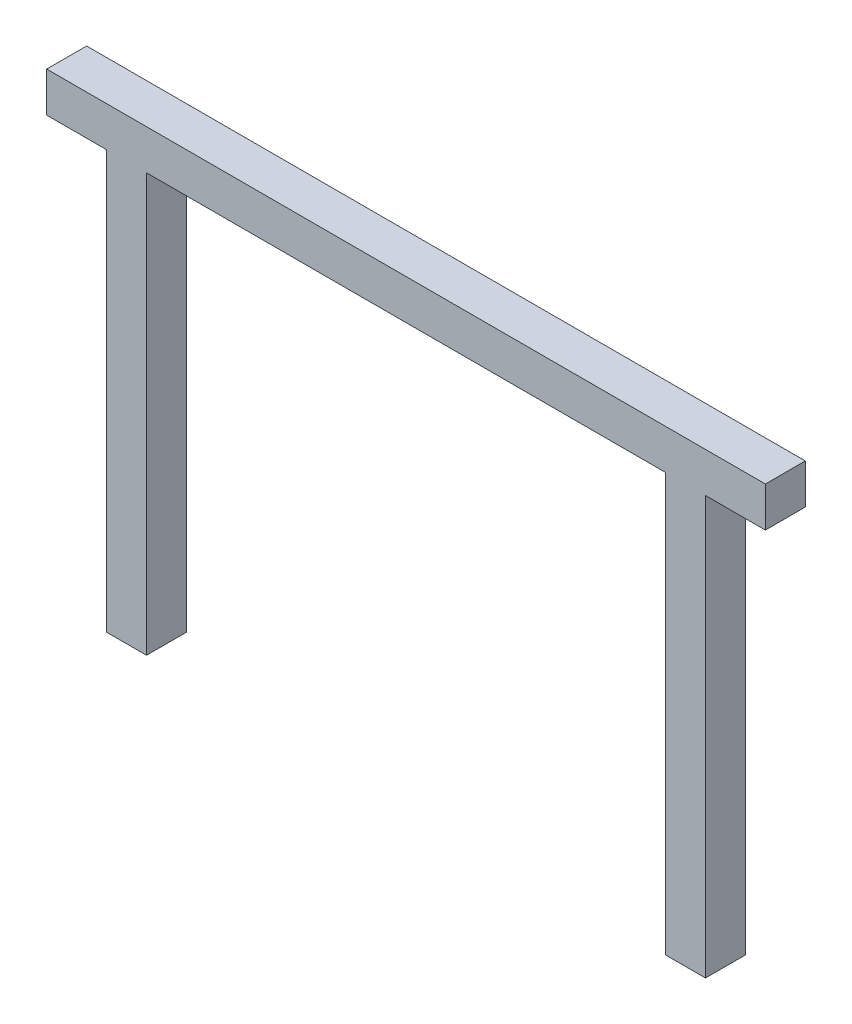
ISO-10303-21;
HEADER;
FILE_DESCRIPTION(('STEP AP214'),'2;1');
FILE_NAME('part.step','',(''),(''),'','','');
FILE_SCHEMA(('AUTOMOTIVE_DESIGN { 1 0 10303 214 1 1 1 1 }'));
ENDSEC;
DATA;
#1=APPLICATION_CONTEXT('core data for automotive mechanical design processes');
#2=APPLICATION_PROTOCOL_DEFINITION('international standard','automotive_design',2000,#1);
#3=PRODUCT_CONTEXT('',#1,'mechanical');
#4=PRODUCT('Part','Part','',(#3));
#5=PRODUCT_RELATED_PRODUCT_CATEGORY('part','',(#4));
#6=PRODUCT_DEFINITION_FORMATION('','',#4);
#7=PRODUCT_DEFINITION_CONTEXT('part definition',#1,'design');
#8=PRODUCT_DEFINITION('design','',#6,#7);
#9=PRODUCT_DEFINITION_SHAPE('','',#8);
#10=(LENGTH_UNIT() NAMED_UNIT(*) SI_UNIT(.MILLI.,.METRE.));
#11=(NAMED_UNIT(*) PLANE_ANGLE_UNIT() SI_UNIT($,.RADIAN.));
#12=(NAMED_UNIT(*) SI_UNIT($,.STERADIAN.) SOLID_ANGLE_UNIT());
#13=UNCERTAINTY_MEASURE_WITH_UNIT(LENGTH_MEASURE(1.E-05),#10,'distance_accuracy_value','');
#14=(GEOMETRIC_REPRESENTATION_CONTEXT(3) GLOBAL_UNCERTAINTY_ASSIGNED_CONTEXT((#13)) GLOBAL_UNIT_ASSIGNED_CONTEXT((#10,
#11,#12)) REPRESENTATION_CONTEXT('',''));
#15=CARTESIAN_POINT('',(0.,0.,0.));
#16=DIRECTION('',(0.,0.,1.));
#17=DIRECTION('',(1.,0.,0.));
#18=AXIS2_PLACEMENT_3D('',#15,#16,#17);
#19=CARTESIAN_POINT('',(90.,-5.,10.));
#20=DIRECTION('',(-1.,0.,0.));
#21=DIRECTION('',(0.,0.,1.));
#22=AXIS2_PLACEMENT_3D('',#19,#20,#21);
#23=PLANE('',#22);
#24=DIRECTION('',(0.,1.,0.));
#25=VECTOR('',#24,1.);
#26=CARTESIAN_POINT('',(90.,-5.,0.));
#27=LINE('',#26,#25);
#28=CARTESIAN_POINT('',(90.,-5.,0.));
#29=VERTEX_POINT('',#28);
#30=CARTESIAN_POINT('',(90.,5.,0.));
#31=VERTEX_POINT('',#30);
#32=EDGE_CURVE('E166',#29,#31,#27,.T.);
#33=ORIENTED_EDGE('',*,*,#32,.T.);
#34=DIRECTION('',(0.,0.,-1.));
#35=VECTOR('',#34,1.);
#36=CARTESIAN_POINT('',(90.,5.,10.));
#37=LINE('',#36,#35);
#38=CARTESIAN_POINT('',(90.,5.,10.));
#39=VERTEX_POINT('',#38);
#40=EDGE_CURVE('E11',#39,#31,#37,.T.);
#41=ORIENTED_EDGE('',*,*,#40,.F.);
#42=DIRECTION('',(0.,1.,0.));
#43=VECTOR('',#42,1.);
#44=CARTESIAN_POINT('',(90.,-5.,10.));
#45=LINE('',#44,#43);
#46=CARTESIAN_POINT('',(90.,-5.,10.));
#47=VERTEX_POINT('',#46);
#48=EDGE_CURVE('E200',#47,#39,#45,.T.);
#49=ORIENTED_EDGE('',*,*,#48,.F.);
#50=DIRECTION('',(0.,0.,-1.));
#51=VECTOR('',#50,1.);
#52=CARTESIAN_POINT('',(90.,-5.,10.));
#53=LINE('',#52,#51);
#54=EDGE_CURVE('E162',#47,#29,#53,.T.);
#55=ORIENTED_EDGE('',*,*,#54,.T.);
#56=EDGE_LOOP('',(#33,#41,#49,#55));
#57=FACE_BOUND('',#56,.T.);
#58=ADVANCED_FACE('F41',(#57),#23,.F.);
#59=CARTESIAN_POINT('',(-90.,5.,10.));
#60=DIRECTION('',(0.,-1.,0.));
#61=DIRECTION('',(0.,0.,-1.));
#62=AXIS2_PLACEMENT_3D('',#59,#60,#61);
#63=PLANE('',#62);
#64=DIRECTION('',(-1.,0.,0.));
#65=VECTOR('',#64,1.);
#66=CARTESIAN_POINT('',(-90.,5.,0.));
#67=LINE('',#66,#65);
#68=CARTESIAN_POINT('',(-90.,5.,0.));
#69=VERTEX_POINT('',#68);
#70=EDGE_CURVE('E170',#31,#69,#67,.T.);
#71=ORIENTED_EDGE('',*,*,#70,.T.);
#72=DIRECTION('',(0.,0.,-1.));
#73=VECTOR('',#72,1.);
#74=CARTESIAN_POINT('',(-90.,5.,10.));
#75=LINE('',#74,#73);
#76=CARTESIAN_POINT('',(-90.,5.,10.));
#77=VERTEX_POINT('',#76);
#78=EDGE_CURVE('E50',#77,#69,#75,.T.);
#79=ORIENTED_EDGE('',*,*,#78,.F.);
#80=DIRECTION('',(-1.,0.,0.));
#81=VECTOR('',#80,1.);
#82=CARTESIAN_POINT('',(-90.,5.,10.));
#83=LINE('',#82,#81);
#84=EDGE_CURVE('E113',#39,#77,#83,.T.);
#85=ORIENTED_EDGE('',*,*,#84,.F.);
#86=ORIENTED_EDGE('',*,*,#40,.T.);
#87=EDGE_LOOP('',(#71,#79,#85,#86));
#88=FACE_BOUND('',#87,.T.);
#89=ADVANCED_FACE('F294',(#88),#63,.F.);
#90=CARTESIAN_POINT('',(-90.,-5.,10.));
#91=DIRECTION('',(1.,0.,0.));
#92=DIRECTION('',(0.,0.,-1.));
#93=AXIS2_PLACEMENT_3D('',#90,#91,#92);
#94=PLANE('',#93);
#95=DIRECTION('',(0.,-1.,0.));
#96=VECTOR('',#95,1.);
#97=CARTESIAN_POINT('',(-90.,-5.,0.));
#98=LINE('',#97,#96);
#99=CARTESIAN_POINT('',(-90.,-5.,0.));
#100=VERTEX_POINT('',#99);
#101=EDGE_CURVE('E173',#69,#100,#98,.T.);
#102=ORIENTED_EDGE('',*,*,#101,.T.);
#103=DIRECTION('',(0.,0.,-1.));
#104=VECTOR('',#103,1.);
#105=CARTESIAN_POINT('',(-90.,-5.,10.));
#106=LINE('',#105,#104);
#107=CARTESIAN_POINT('',(-90.,-5.,10.));
#108=VERTEX_POINT('',#107);
#109=EDGE_CURVE('E227',#108,#100,#106,.T.);
#110=ORIENTED_EDGE('',*,*,#109,.F.);
#111=DIRECTION('',(0.,-1.,0.));
#112=VECTOR('',#111,1.);
#113=CARTESIAN_POINT('',(-90.,-5.,10.));
#114=LINE('',#113,#112);
#115=EDGE_CURVE('E237',#77,#108,#114,.T.);
#116=ORIENTED_EDGE('',*,*,#115,.F.);
#117=ORIENTED_EDGE('',*,*,#78,.T.);
#118=EDGE_LOOP('',(#102,#110,#116,#117));
#119=FACE_BOUND('',#118,.T.);
#120=ADVANCED_FACE('F235',(#119),#94,.F.);
#121=CARTESIAN_POINT('',(-90.,-5.,10.));
#122=DIRECTION('',(0.,1.,0.));
#123=DIRECTION('',(-1.,0.,0.));
#124=AXIS2_PLACEMENT_3D('',#121,#122,#123);
#125=PLANE('',#124);
#126=DIRECTION('',(1.,0.,0.));
#127=VECTOR('',#126,1.);
#128=CARTESIAN_POINT('',(-90.,-5.,0.));
#129=LINE('',#128,#127);
#130=CARTESIAN_POINT('',(-75.,-5.,0.));
#131=VERTEX_POINT('',#130);
#132=EDGE_CURVE('E176',#100,#131,#129,.T.);
#133=ORIENTED_EDGE('',*,*,#132,.T.);
#134=DIRECTION('',(0.,0.,-1.));
#135=VECTOR('',#134,1.);
#136=CARTESIAN_POINT('',(-75.,-5.,10.));
#137=LINE('',#136,#135);
#138=CARTESIAN_POINT('',(-75.,-5.,10.));
#139=VERTEX_POINT('',#138);
#140=EDGE_CURVE('E223',#139,#131,#137,.T.);
#141=ORIENTED_EDGE('',*,*,#140,.F.);
#142=DIRECTION('',(1.,0.,0.));
#143=VECTOR('',#142,1.);
#144=CARTESIAN_POINT('',(-90.,-5.,10.));
#145=LINE('',#144,#143);
#146=EDGE_CURVE('E256',#108,#139,#145,.T.);
#147=ORIENTED_EDGE('',*,*,#146,.F.);
#148=ORIENTED_EDGE('',*,*,#109,.T.);
#149=EDGE_LOOP('',(#133,#141,#147,#148));
#150=FACE_BOUND('',#149,.T.);
#151=ADVANCED_FACE('F246',(#150),#125,.F.);
#152=CARTESIAN_POINT('',(-75.,-109.651162790698,10.));
#153=DIRECTION('',(1.,0.,0.));
#154=DIRECTION('',(0.,0.,-1.));
#155=AXIS2_PLACEMENT_3D('',#152,#153,#154);
#156=PLANE('',#155);
#157=DIRECTION('',(0.,-1.,0.));
#158=VECTOR('',#157,1.);
#159=CARTESIAN_POINT('',(-75.,-109.651162790698,0.));
#160=LINE('',#159,#158);
#161=CARTESIAN_POINT('',(-75.,-109.651162790698,0.));
#162=VERTEX_POINT('',#161);
#163=EDGE_CURVE('E179',#131,#162,#160,.T.);
#164=ORIENTED_EDGE('',*,*,#163,.T.);
#165=DIRECTION('',(0.,0.,-1.));
#166=VECTOR('',#165,1.);
#167=CARTESIAN_POINT('',(-75.,-109.651162790698,10.));
#168=LINE('',#167,#166);
#169=CARTESIAN_POINT('',(-75.,-109.651162790698,10.));
#170=VERTEX_POINT('',#169);
#171=EDGE_CURVE('E219',#170,#162,#168,.T.);
#172=ORIENTED_EDGE('',*,*,#171,.F.);
#173=DIRECTION('',(0.,-1.,0.));
#174=VECTOR('',#173,1.);
#175=CARTESIAN_POINT('',(-75.,-109.651162790698,10.));
#176=LINE('',#175,#174);
#177=EDGE_CURVE('E252',#139,#170,#176,.T.);
#178=ORIENTED_EDGE('',*,*,#177,.F.);
#179=ORIENTED_EDGE('',*,*,#140,.T.);
#180=EDGE_LOOP('',(#164,#172,#178,#179));
#181=FACE_BOUND('',#180,.T.);
#182=ADVANCED_FACE('F250',(#181),#156,.F.);
#183=CARTESIAN_POINT('',(-75.,-109.651162790698,10.));
#184=DIRECTION('',(0.,1.,0.));
#185=DIRECTION('',(0.,0.,1.));
#186=AXIS2_PLACEMENT_3D('',#183,#184,#185);
#187=PLANE('',#186);
#188=DIRECTION('',(1.,0.,0.));
#189=VECTOR('',#188,1.);
#190=CARTESIAN_POINT('',(-75.,-109.651162790698,0.));
#191=LINE('',#190,#189);
#192=CARTESIAN_POINT('',(-65.,-109.651162790698,0.));
#193=VERTEX_POINT('',#192);
#194=EDGE_CURVE('E182',#162,#193,#191,.T.);
#195=ORIENTED_EDGE('',*,*,#194,.T.);
#196=DIRECTION('',(0.,0.,-1.));
#197=VECTOR('',#196,1.);
#198=CARTESIAN_POINT('',(-65.,-109.651162790698,10.));
#199=LINE('',#198,#197);
#200=CARTESIAN_POINT('',(-65.,-109.651162790698,10.));
#201=VERTEX_POINT('',#200);
#202=EDGE_CURVE('E215',#201,#193,#199,.T.);
#203=ORIENTED_EDGE('',*,*,#202,.F.);
#204=DIRECTION('',(1.,0.,0.));
#205=VECTOR('',#204,1.);
#206=CARTESIAN_POINT('',(-75.,-109.651162790698,10.));
#207=LINE('',#206,#205);
#208=EDGE_CURVE('E255',#170,#201,#207,.T.);
#209=ORIENTED_EDGE('',*,*,#208,.F.);
#210=ORIENTED_EDGE('',*,*,#171,.T.);
#211=EDGE_LOOP('',(#195,#203,#209,#210));
#212=FACE_BOUND('',#211,.T.);
#213=ADVANCED_FACE('F307',(#212),#187,.F.);
#214=CARTESIAN_POINT('',(-65.,-109.651162790698,10.));
#215=DIRECTION('',(-1.,0.,0.));
#216=DIRECTION('',(0.,0.,1.));
#217=AXIS2_PLACEMENT_3D('',#214,#215,#216);
#218=PLANE('',#217);
#219=DIRECTION('',(0.,1.,0.));
#220=VECTOR('',#219,1.);
#221=CARTESIAN_POINT('',(-65.,-109.651162790698,0.));
#222=LINE('',#221,#220);
#223=CARTESIAN_POINT('',(-65.,-5.,0.));
#224=VERTEX_POINT('',#223);
#225=EDGE_CURVE('E185',#193,#224,#222,.T.);
#226=ORIENTED_EDGE('',*,*,#225,.T.);
#227=DIRECTION('',(0.,0.,-1.));
#228=VECTOR('',#227,1.);
#229=CARTESIAN_POINT('',(-65.,-5.,10.));
#230=LINE('',#229,#228);
#231=CARTESIAN_POINT('',(-65.,-5.,10.));
#232=VERTEX_POINT('',#231);
#233=EDGE_CURVE('E211',#232,#224,#230,.T.);
#234=ORIENTED_EDGE('',*,*,#233,.F.);
#235=DIRECTION('',(0.,1.,0.));
#236=VECTOR('',#235,1.);
#237=CARTESIAN_POINT('',(-65.,-109.651162790698,10.));
#238=LINE('',#237,#236);
#239=EDGE_CURVE('E260',#201,#232,#238,.T.);
#240=ORIENTED_EDGE('',*,*,#239,.F.);
#241=ORIENTED_EDGE('',*,*,#202,.T.);
#242=EDGE_LOOP('',(#226,#234,#240,#241));
#243=FACE_BOUND('',#242,.T.);
#244=ADVANCED_FACE('F310',(#243),#218,.F.);
#245=CARTESIAN_POINT('',(-65.,-5.,10.));
#246=DIRECTION('',(0.,1.,0.));
#247=DIRECTION('',(0.,0.,1.));
#248=AXIS2_PLACEMENT_3D('',#245,#246,#247);
#249=PLANE('',#248);
#250=DIRECTION('',(1.,0.,0.));
#251=VECTOR('',#250,1.);
#252=CARTESIAN_POINT('',(-65.,-5.,0.));
#253=LINE('',#252,#251);
#254=CARTESIAN_POINT('',(65.,-5.,0.));
#255=VERTEX_POINT('',#254);
#256=EDGE_CURVE('E188',#224,#255,#253,.T.);
#257=ORIENTED_EDGE('',*,*,#256,.T.);
#258=DIRECTION('',(0.,0.,-1.));
#259=VECTOR('',#258,1.);
#260=CARTESIAN_POINT('',(65.,-5.,10.));
#261=LINE('',#260,#259);
#262=CARTESIAN_POINT('',(65.,-5.,10.));
#263=VERTEX_POINT('',#262);
#264=EDGE_CURVE('E207',#263,#255,#261,.T.);
#265=ORIENTED_EDGE('',*,*,#264,.F.);
#266=DIRECTION('',(1.,0.,0.));
#267=VECTOR('',#266,1.);
#268=CARTESIAN_POINT('',(-65.,-5.,10.));
#269=LINE('',#268,#267);
#270=EDGE_CURVE('E267',#232,#263,#269,.T.);
#271=ORIENTED_EDGE('',*,*,#270,.F.);
#272=ORIENTED_EDGE('',*,*,#233,.T.);
#273=EDGE_LOOP('',(#257,#265,#271,#272));
#274=FACE_BOUND('',#273,.T.);
#275=ADVANCED_FACE('F275',(#274),#249,.F.);
#276=CARTESIAN_POINT('',(65.,-109.651162790698,10.));
#277=DIRECTION('',(1.,0.,0.));
#278=DIRECTION('',(0.,0.,-1.));
#279=AXIS2_PLACEMENT_3D('',#276,#277,#278);
#280=PLANE('',#279);
#281=DIRECTION('',(0.,-1.,0.));
#282=VECTOR('',#281,1.);
#283=CARTESIAN_POINT('',(65.,-109.651162790698,0.));
#284=LINE('',#283,#282);
#285=CARTESIAN_POINT('',(65.,-109.651162790698,0.));
#286=VERTEX_POINT('',#285);
#287=EDGE_CURVE('E191',#255,#286,#284,.T.);
#288=ORIENTED_EDGE('',*,*,#287,.T.);
#289=DIRECTION('',(0.,0.,-1.));
#290=VECTOR('',#289,1.);
#291=CARTESIAN_POINT('',(65.,-109.651162790698,10.));
#292=LINE('',#291,#290);
#293=CARTESIAN_POINT('',(65.,-109.651162790698,10.));
#294=VERTEX_POINT('',#293);
#295=EDGE_CURVE('E155',#294,#286,#292,.T.);
#296=ORIENTED_EDGE('',*,*,#295,.F.);
#297=DIRECTION('',(0.,-1.,0.));
#298=VECTOR('',#297,1.);
#299=CARTESIAN_POINT('',(65.,-109.651162790698,10.));
#300=LINE('',#299,#298);
#301=EDGE_CURVE('E144',#263,#294,#300,.T.);
#302=ORIENTED_EDGE('',*,*,#301,.F.);
#303=ORIENTED_EDGE('',*,*,#264,.T.);
#304=EDGE_LOOP('',(#288,#296,#302,#303));
#305=FACE_BOUND('',#304,.T.);
#306=ADVANCED_FACE('F279',(#305),#280,.F.);
#307=CARTESIAN_POINT('',(65.,-109.651162790698,10.));
#308=DIRECTION('',(0.,1.,0.));
#309=DIRECTION('',(0.,0.,1.));
#310=AXIS2_PLACEMENT_3D('',#307,#308,#309);
#311=PLANE('',#310);
#312=DIRECTION('',(1.,0.,0.));
#313=VECTOR('',#312,1.);
#314=CARTESIAN_POINT('',(65.,-109.651162790698,0.));
#315=LINE('',#314,#313);
#316=CARTESIAN_POINT('',(75.,-109.651162790698,0.));
#317=VERTEX_POINT('',#316);
#318=EDGE_CURVE('E153',#286,#317,#315,.T.);
#319=ORIENTED_EDGE('',*,*,#318,.T.);
#320=DIRECTION('',(0.,0.,-1.));
#321=VECTOR('',#320,1.);
#322=CARTESIAN_POINT('',(75.,-109.651162790698,10.));
#323=LINE('',#322,#321);
#324=CARTESIAN_POINT('',(75.,-109.651162790698,10.));
#325=VERTEX_POINT('',#324);
#326=EDGE_CURVE('E150',#325,#317,#323,.T.);
#327=ORIENTED_EDGE('',*,*,#326,.F.);
#328=DIRECTION('',(1.,0.,0.));
#329=VECTOR('',#328,1.);
#330=CARTESIAN_POINT('',(65.,-109.651162790698,10.));
#331=LINE('',#330,#329);
#332=EDGE_CURVE('E138',#294,#325,#331,.T.);
#333=ORIENTED_EDGE('',*,*,#332,.F.);
#334=ORIENTED_EDGE('',*,*,#295,.T.);
#335=EDGE_LOOP('',(#319,#327,#333,#334));
#336=FACE_BOUND('',#335,.T.);
#337=ADVANCED_FACE('F151',(#336),#311,.F.);
#338=CARTESIAN_POINT('',(75.,-109.651162790698,10.));
#339=DIRECTION('',(-1.,0.,0.));
#340=DIRECTION('',(0.,0.,1.));
#341=AXIS2_PLACEMENT_3D('',#338,#339,#340);
#342=PLANE('',#341);
#343=DIRECTION('',(0.,1.,0.));
#344=VECTOR('',#343,1.);
#345=CARTESIAN_POINT('',(75.,-109.651162790698,0.));
#346=LINE('',#345,#344);
#347=CARTESIAN_POINT('',(75.,-5.,0.));
#348=VERTEX_POINT('',#347);
#349=EDGE_CURVE('E99',#317,#348,#346,.T.);
#350=ORIENTED_EDGE('',*,*,#349,.T.);
#351=DIRECTION('',(0.,0.,-1.));
#352=VECTOR('',#351,1.);
#353=CARTESIAN_POINT('',(75.,-5.,10.));
#354=LINE('',#353,#352);
#355=CARTESIAN_POINT('',(75.,-5.,10.));
#356=VERTEX_POINT('',#355);
#357=EDGE_CURVE('E156',#356,#348,#354,.T.);
#358=ORIENTED_EDGE('',*,*,#357,.F.);
#359=DIRECTION('',(0.,1.,0.));
#360=VECTOR('',#359,1.);
#361=CARTESIAN_POINT('',(75.,-109.651162790698,10.));
#362=LINE('',#361,#360);
#363=EDGE_CURVE('E142',#325,#356,#362,.T.);
#364=ORIENTED_EDGE('',*,*,#363,.F.);
#365=ORIENTED_EDGE('',*,*,#326,.T.);
#366=EDGE_LOOP('',(#350,#358,#364,#365));
#367=FACE_BOUND('',#366,.T.);
#368=ADVANCED_FACE('F158',(#367),#342,.F.);
#369=CARTESIAN_POINT('',(75.,-5.,10.));
#370=DIRECTION('',(0.,1.,0.));
#371=DIRECTION('',(-1.,0.,0.));
#372=AXIS2_PLACEMENT_3D('',#369,#370,#371);
#373=PLANE('',#372);
#374=DIRECTION('',(1.,0.,0.));
#375=VECTOR('',#374,1.);
#376=CARTESIAN_POINT('',(75.,-5.,0.));
#377=LINE('',#376,#375);
#378=EDGE_CURVE('E105',#348,#29,#377,.T.);
#379=ORIENTED_EDGE('',*,*,#378,.T.);
#380=ORIENTED_EDGE('',*,*,#54,.F.);
#381=DIRECTION('',(1.,0.,0.));
#382=VECTOR('',#381,1.);
#383=CARTESIAN_POINT('',(75.,-5.,10.));
#384=LINE('',#383,#382);
#385=EDGE_CURVE('E58',#356,#47,#384,.T.);
#386=ORIENTED_EDGE('',*,*,#385,.F.);
#387=ORIENTED_EDGE('',*,*,#357,.T.);
#388=EDGE_LOOP('',(#379,#380,#386,#387));
#389=FACE_BOUND('',#388,.T.);
#390=ADVANCED_FACE('F283',(#389),#373,.F.);
#391=CARTESIAN_POINT('',(0.,0.,10.));
#392=DIRECTION('',(0.,0.,-1.));
#393=DIRECTION('',(-1.,0.,0.));
#394=AXIS2_PLACEMENT_3D('',#391,#392,#393);
#395=PLANE('',#394);
#396=ORIENTED_EDGE('',*,*,#48,.T.);
#397=ORIENTED_EDGE('',*,*,#84,.T.);
#398=ORIENTED_EDGE('',*,*,#115,.T.);
#399=ORIENTED_EDGE('',*,*,#146,.T.);
#400=ORIENTED_EDGE('',*,*,#177,.T.);
#401=ORIENTED_EDGE('',*,*,#208,.T.);
#402=ORIENTED_EDGE('',*,*,#239,.T.);
#403=ORIENTED_EDGE('',*,*,#270,.T.);
#404=ORIENTED_EDGE('',*,*,#301,.T.);
#405=ORIENTED_EDGE('',*,*,#332,.T.);
#406=ORIENTED_EDGE('',*,*,#363,.T.);
#407=ORIENTED_EDGE('',*,*,#385,.T.);
#408=EDGE_LOOP('',(#396,#397,#398,#399,#400,#401,#402,#403,#404,#405,#406,#407));
#409=FACE_BOUND('',#408,.T.);
#410=ADVANCED_FACE('F140',(#409),#395,.F.);
#411=CARTESIAN_POINT('',(0.,0.,0.));
#412=DIRECTION('',(0.,0.,-1.));
#413=DIRECTION('',(-1.,0.,0.));
#414=AXIS2_PLACEMENT_3D('',#411,#412,#413);
#415=PLANE('',#414);
#416=ORIENTED_EDGE('',*,*,#32,.F.);
#417=ORIENTED_EDGE('',*,*,#378,.F.);
#418=ORIENTED_EDGE('',*,*,#349,.F.);
#419=ORIENTED_EDGE('',*,*,#318,.F.);
#420=ORIENTED_EDGE('',*,*,#287,.F.);
#421=ORIENTED_EDGE('',*,*,#256,.F.);
#422=ORIENTED_EDGE('',*,*,#225,.F.);
#423=ORIENTED_EDGE('',*,*,#194,.F.);
#424=ORIENTED_EDGE('',*,*,#163,.F.);
#425=ORIENTED_EDGE('',*,*,#132,.F.);
#426=ORIENTED_EDGE('',*,*,#101,.F.);
#427=ORIENTED_EDGE('',*,*,#70,.F.);
#428=EDGE_LOOP('',(#416,#417,#418,#419,#420,#421,#422,#423,#424,#425,#426,#427));
#429=FACE_BOUND('',#428,.T.);
#430=ADVANCED_FACE('F241',(#429),#415,.T.);
#431=CLOSED_SHELL('',(#58,#89,#120,#151,#182,#213,#244,#275,#306,#337,#368,#390,#410,#430));
#432=MANIFOLD_SOLID_BREP('B2',#431);
#433=ADVANCED_BREP_SHAPE_REPRESENTATION('',(#18,#432),#14);
#434=SHAPE_DEFINITION_REPRESENTATION(#9,#433);
ENDSEC;
END-ISO-10303-21;
